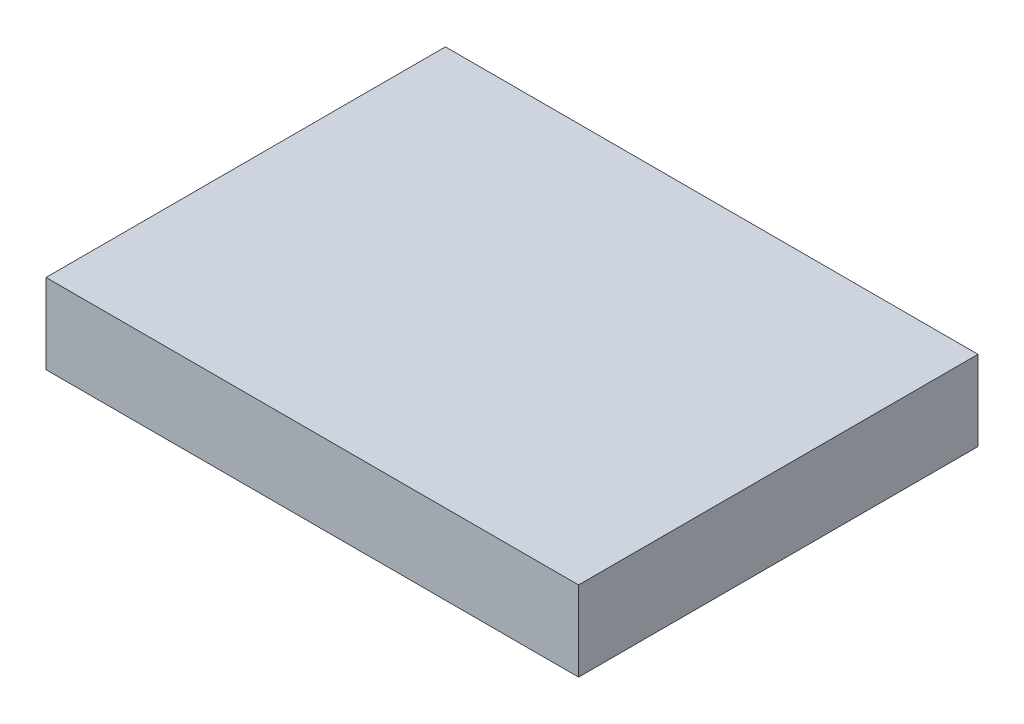
ISO-10303-21;
HEADER;
FILE_DESCRIPTION(('STEP AP214'),'2;1');
FILE_NAME('part.step','',(''),(''),'','','');
FILE_SCHEMA(('AUTOMOTIVE_DESIGN { 1 0 10303 214 1 1 1 1 }'));
ENDSEC;
DATA;
#1=APPLICATION_CONTEXT('core data for automotive mechanical design processes');
#2=APPLICATION_PROTOCOL_DEFINITION('international standard','automotive_design',2000,#1);
#3=PRODUCT_CONTEXT('',#1,'mechanical');
#4=PRODUCT('Part','Part','',(#3));
#5=PRODUCT_RELATED_PRODUCT_CATEGORY('part','',(#4));
#6=PRODUCT_DEFINITION_FORMATION('','',#4);
#7=PRODUCT_DEFINITION_CONTEXT('part definition',#1,'design');
#8=PRODUCT_DEFINITION('design','',#6,#7);
#9=PRODUCT_DEFINITION_SHAPE('','',#8);
#10=(LENGTH_UNIT() NAMED_UNIT(*) SI_UNIT(.MILLI.,.METRE.));
#11=(NAMED_UNIT(*) PLANE_ANGLE_UNIT() SI_UNIT($,.RADIAN.));
#12=(NAMED_UNIT(*) SI_UNIT($,.STERADIAN.) SOLID_ANGLE_UNIT());
#13=UNCERTAINTY_MEASURE_WITH_UNIT(LENGTH_MEASURE(1.E-05),#10,'distance_accuracy_value','');
#14=(GEOMETRIC_REPRESENTATION_CONTEXT(3) GLOBAL_UNCERTAINTY_ASSIGNED_CONTEXT((#13)) GLOBAL_UNIT_ASSIGNED_CONTEXT((#10,
#11,#12)) REPRESENTATION_CONTEXT('',''));
#15=CARTESIAN_POINT('',(0.,0.,0.));
#16=DIRECTION('',(0.,0.,1.));
#17=DIRECTION('',(1.,0.,0.));
#18=AXIS2_PLACEMENT_3D('',#15,#16,#17);
#19=CARTESIAN_POINT('',(0.,7.62,0.));
#20=DIRECTION('',(1.,0.,0.));
#21=DIRECTION('',(0.,0.,-1.));
#22=AXIS2_PLACEMENT_3D('',#19,#20,#21);
#23=PLANE('',#22);
#24=DIRECTION('',(0.,0.,1.));
#25=VECTOR('',#24,1.);
#26=CARTESIAN_POINT('',(0.,0.,0.));
#27=LINE('',#26,#25);
#28=CARTESIAN_POINT('',(0.,0.,-38.1));
#29=VERTEX_POINT('',#28);
#30=CARTESIAN_POINT('',(0.,0.,0.));
#31=VERTEX_POINT('',#30);
#32=EDGE_CURVE('E96',#29,#31,#27,.T.);
#33=ORIENTED_EDGE('',*,*,#32,.T.);
#34=DIRECTION('',(0.,-1.,0.));
#35=VECTOR('',#34,1.);
#36=CARTESIAN_POINT('',(0.,7.62,0.));
#37=LINE('',#36,#35);
#38=CARTESIAN_POINT('',(0.,7.62,0.));
#39=VERTEX_POINT('',#38);
#40=EDGE_CURVE('E11',#39,#31,#37,.T.);
#41=ORIENTED_EDGE('',*,*,#40,.F.);
#42=DIRECTION('',(0.,0.,1.));
#43=VECTOR('',#42,1.);
#44=CARTESIAN_POINT('',(0.,7.62,0.));
#45=LINE('',#44,#43);
#46=CARTESIAN_POINT('',(0.,7.62,-38.1));
#47=VERTEX_POINT('',#46);
#48=EDGE_CURVE('E84',#47,#39,#45,.T.);
#49=ORIENTED_EDGE('',*,*,#48,.F.);
#50=DIRECTION('',(0.,-1.,0.));
#51=VECTOR('',#50,1.);
#52=CARTESIAN_POINT('',(0.,7.62,-38.1));
#53=LINE('',#52,#51);
#54=EDGE_CURVE('E92',#47,#29,#53,.T.);
#55=ORIENTED_EDGE('',*,*,#54,.T.);
#56=EDGE_LOOP('',(#33,#41,#49,#55));
#57=FACE_BOUND('',#56,.T.);
#58=ADVANCED_FACE('F33',(#57),#23,.F.);
#59=CARTESIAN_POINT('',(0.,7.62,0.));
#60=DIRECTION('',(0.,0.,-1.));
#61=DIRECTION('',(-1.,0.,0.));
#62=AXIS2_PLACEMENT_3D('',#59,#60,#61);
#63=PLANE('',#62);
#64=DIRECTION('',(1.,0.,0.));
#65=VECTOR('',#64,1.);
#66=CARTESIAN_POINT('',(0.,0.,0.));
#67=LINE('',#66,#65);
#68=CARTESIAN_POINT('',(50.8,0.,0.));
#69=VERTEX_POINT('',#68);
#70=EDGE_CURVE('E88',#31,#69,#67,.T.);
#71=ORIENTED_EDGE('',*,*,#70,.T.);
#72=DIRECTION('',(0.,-1.,0.));
#73=VECTOR('',#72,1.);
#74=CARTESIAN_POINT('',(50.8,7.62,0.));
#75=LINE('',#74,#73);
#76=CARTESIAN_POINT('',(50.8,7.62,0.));
#77=VERTEX_POINT('',#76);
#78=EDGE_CURVE('E41',#77,#69,#75,.T.);
#79=ORIENTED_EDGE('',*,*,#78,.F.);
#80=DIRECTION('',(1.,0.,0.));
#81=VECTOR('',#80,1.);
#82=CARTESIAN_POINT('',(0.,7.62,0.));
#83=LINE('',#82,#81);
#84=EDGE_CURVE('E79',#39,#77,#83,.T.);
#85=ORIENTED_EDGE('',*,*,#84,.F.);
#86=ORIENTED_EDGE('',*,*,#40,.T.);
#87=EDGE_LOOP('',(#71,#79,#85,#86));
#88=FACE_BOUND('',#87,.T.);
#89=ADVANCED_FACE('F87',(#88),#63,.F.);
#90=CARTESIAN_POINT('',(50.8,7.62,0.));
#91=DIRECTION('',(-1.,0.,0.));
#92=DIRECTION('',(0.,0.,1.));
#93=AXIS2_PLACEMENT_3D('',#90,#91,#92);
#94=PLANE('',#93);
#95=DIRECTION('',(0.,0.,-1.));
#96=VECTOR('',#95,1.);
#97=CARTESIAN_POINT('',(50.8,0.,0.));
#98=LINE('',#97,#96);
#99=CARTESIAN_POINT('',(50.8,0.,-38.1));
#100=VERTEX_POINT('',#99);
#101=EDGE_CURVE('E66',#69,#100,#98,.T.);
#102=ORIENTED_EDGE('',*,*,#101,.T.);
#103=DIRECTION('',(0.,-1.,0.));
#104=VECTOR('',#103,1.);
#105=CARTESIAN_POINT('',(50.8,7.62,-38.1));
#106=LINE('',#105,#104);
#107=CARTESIAN_POINT('',(50.8,7.62,-38.1));
#108=VERTEX_POINT('',#107);
#109=EDGE_CURVE('E89',#108,#100,#106,.T.);
#110=ORIENTED_EDGE('',*,*,#109,.F.);
#111=DIRECTION('',(0.,0.,-1.));
#112=VECTOR('',#111,1.);
#113=CARTESIAN_POINT('',(50.8,7.62,0.));
#114=LINE('',#113,#112);
#115=EDGE_CURVE('E82',#77,#108,#114,.T.);
#116=ORIENTED_EDGE('',*,*,#115,.F.);
#117=ORIENTED_EDGE('',*,*,#78,.T.);
#118=EDGE_LOOP('',(#102,#110,#116,#117));
#119=FACE_BOUND('',#118,.T.);
#120=ADVANCED_FACE('F90',(#119),#94,.F.);
#121=CARTESIAN_POINT('',(0.,7.62,-38.1));
#122=DIRECTION('',(0.,0.,1.));
#123=DIRECTION('',(1.,0.,0.));
#124=AXIS2_PLACEMENT_3D('',#121,#122,#123);
#125=PLANE('',#124);
#126=DIRECTION('',(-1.,0.,0.));
#127=VECTOR('',#126,1.);
#128=CARTESIAN_POINT('',(0.,0.,-38.1));
#129=LINE('',#128,#127);
#130=EDGE_CURVE('E72',#100,#29,#129,.T.);
#131=ORIENTED_EDGE('',*,*,#130,.T.);
#132=ORIENTED_EDGE('',*,*,#54,.F.);
#133=DIRECTION('',(-1.,0.,0.));
#134=VECTOR('',#133,1.);
#135=CARTESIAN_POINT('',(0.,7.62,-38.1));
#136=LINE('',#135,#134);
#137=EDGE_CURVE('E49',#108,#47,#136,.T.);
#138=ORIENTED_EDGE('',*,*,#137,.F.);
#139=ORIENTED_EDGE('',*,*,#109,.T.);
#140=EDGE_LOOP('',(#131,#132,#138,#139));
#141=FACE_BOUND('',#140,.T.);
#142=ADVANCED_FACE('F103',(#141),#125,.F.);
#143=CARTESIAN_POINT('',(0.,7.62,0.));
#144=DIRECTION('',(0.,-1.,0.));
#145=DIRECTION('',(0.,0.,-1.));
#146=AXIS2_PLACEMENT_3D('',#143,#144,#145);
#147=PLANE('',#146);
#148=ORIENTED_EDGE('',*,*,#48,.T.);
#149=ORIENTED_EDGE('',*,*,#84,.T.);
#150=ORIENTED_EDGE('',*,*,#115,.T.);
#151=ORIENTED_EDGE('',*,*,#137,.T.);
#152=EDGE_LOOP('',(#148,#149,#150,#151));
#153=FACE_BOUND('',#152,.T.);
#154=ADVANCED_FACE('F80',(#153),#147,.F.);
#155=CARTESIAN_POINT('',(0.,0.,0.));
#156=DIRECTION('',(0.,-1.,0.));
#157=DIRECTION('',(0.,0.,-1.));
#158=AXIS2_PLACEMENT_3D('',#155,#156,#157);
#159=PLANE('',#158);
#160=ORIENTED_EDGE('',*,*,#32,.F.);
#161=ORIENTED_EDGE('',*,*,#130,.F.);
#162=ORIENTED_EDGE('',*,*,#101,.F.);
#163=ORIENTED_EDGE('',*,*,#70,.F.);
#164=EDGE_LOOP('',(#160,#161,#162,#163));
#165=FACE_BOUND('',#164,.T.);
#166=ADVANCED_FACE('F106',(#165),#159,.T.);
#167=CLOSED_SHELL('',(#58,#89,#120,#142,#154,#166));
#168=MANIFOLD_SOLID_BREP('B2',#167);
#169=ADVANCED_BREP_SHAPE_REPRESENTATION('',(#18,#168),#14);
#170=SHAPE_DEFINITION_REPRESENTATION(#9,#169);
ENDSEC;
END-ISO-10303-21;
